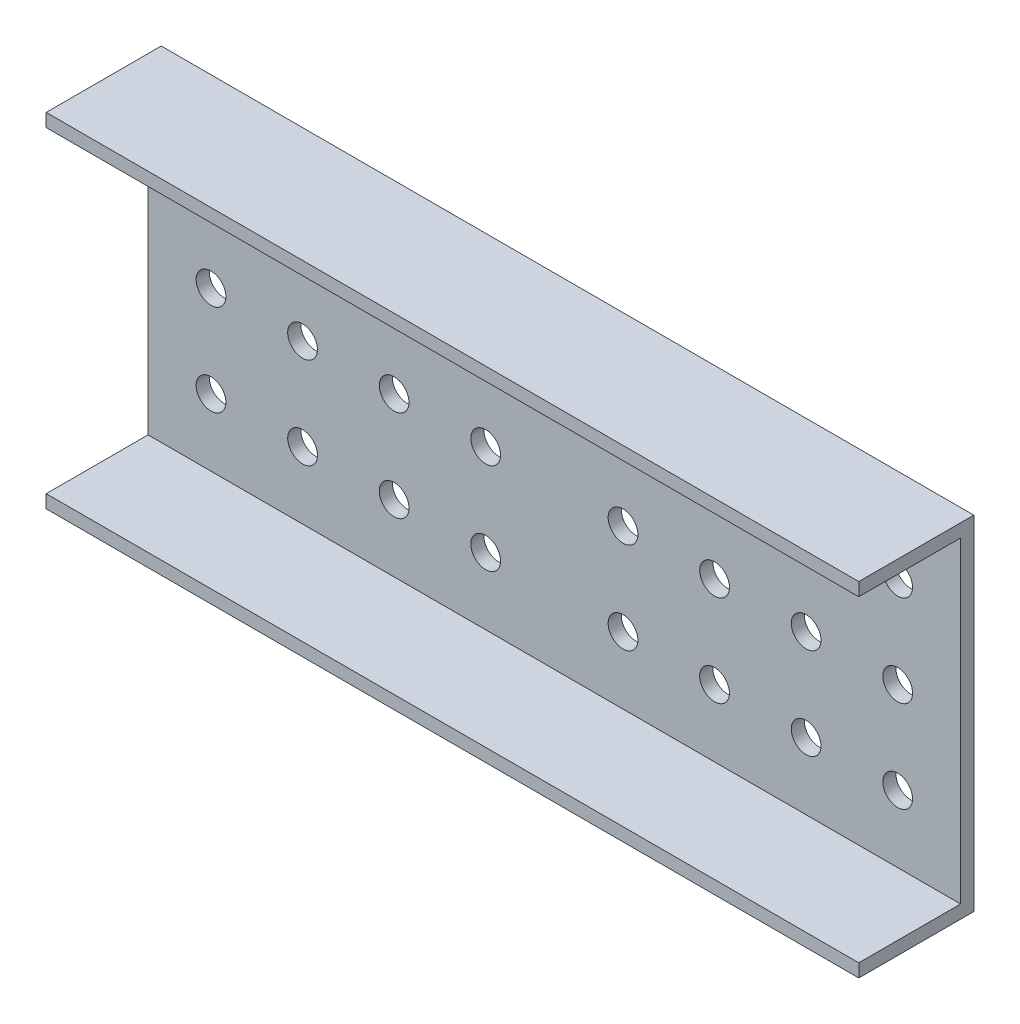
ISO-10303-21;
HEADER;
FILE_DESCRIPTION(('STEP AP214'),'2;1');
FILE_NAME('part.step','',(''),(''),'','','');
FILE_SCHEMA(('AUTOMOTIVE_DESIGN { 1 0 10303 214 1 1 1 1 }'));
ENDSEC;
DATA;
#1=APPLICATION_CONTEXT('core data for automotive mechanical design processes');
#2=APPLICATION_PROTOCOL_DEFINITION('international standard','automotive_design',2000,#1);
#3=PRODUCT_CONTEXT('',#1,'mechanical');
#4=PRODUCT('Part','Part','',(#3));
#5=PRODUCT_RELATED_PRODUCT_CATEGORY('part','',(#4));
#6=PRODUCT_DEFINITION_FORMATION('','',#4);
#7=PRODUCT_DEFINITION_CONTEXT('part definition',#1,'design');
#8=PRODUCT_DEFINITION('design','',#6,#7);
#9=PRODUCT_DEFINITION_SHAPE('','',#8);
#10=(LENGTH_UNIT() NAMED_UNIT(*) SI_UNIT(.MILLI.,.METRE.));
#11=(NAMED_UNIT(*) PLANE_ANGLE_UNIT() SI_UNIT($,.RADIAN.));
#12=(NAMED_UNIT(*) SI_UNIT($,.STERADIAN.) SOLID_ANGLE_UNIT());
#13=UNCERTAINTY_MEASURE_WITH_UNIT(LENGTH_MEASURE(1.E-05),#10,'distance_accuracy_value','');
#14=(GEOMETRIC_REPRESENTATION_CONTEXT(3) GLOBAL_UNCERTAINTY_ASSIGNED_CONTEXT((#13)) GLOBAL_UNIT_ASSIGNED_CONTEXT((#10,
#11,#12)) REPRESENTATION_CONTEXT('',''));
#15=CARTESIAN_POINT('',(0.,0.,0.));
#16=DIRECTION('',(0.,0.,1.));
#17=DIRECTION('',(1.,0.,0.));
#18=AXIS2_PLACEMENT_3D('',#15,#16,#17);
#19=CARTESIAN_POINT('',(355.,150.,11.5));
#20=DIRECTION('',(-1.,0.,0.));
#21=DIRECTION('',(0.,-1.,0.));
#22=AXIS2_PLACEMENT_3D('',#19,#20,#21);
#23=PLANE('',#22);
#24=DIRECTION('',(0.,1.,0.));
#25=VECTOR('',#24,1.);
#26=CARTESIAN_POINT('',(355.,150.,0.));
#27=LINE('',#26,#25);
#28=CARTESIAN_POINT('',(355.,-150.,0.));
#29=VERTEX_POINT('',#28);
#30=CARTESIAN_POINT('',(355.,150.,0.));
#31=VERTEX_POINT('',#30);
#32=EDGE_CURVE('E194',#29,#31,#27,.T.);
#33=ORIENTED_EDGE('',*,*,#32,.T.);
#34=DIRECTION('',(0.,0.,-1.));
#35=VECTOR('',#34,1.);
#36=CARTESIAN_POINT('',(355.,150.,11.5));
#37=LINE('',#36,#35);
#38=CARTESIAN_POINT('',(355.,150.,100.5));
#39=VERTEX_POINT('',#38);
#40=EDGE_CURVE('E208',#39,#31,#37,.T.);
#41=ORIENTED_EDGE('',*,*,#40,.F.);
#42=DIRECTION('',(0.,1.,0.));
#43=VECTOR('',#42,1.);
#44=CARTESIAN_POINT('',(355.,138.5,100.5));
#45=LINE('',#44,#43);
#46=CARTESIAN_POINT('',(355.,138.5,100.5));
#47=VERTEX_POINT('',#46);
#48=EDGE_CURVE('E145',#47,#39,#45,.T.);
#49=ORIENTED_EDGE('',*,*,#48,.F.);
#50=DIRECTION('',(0.,0.,-1.));
#51=VECTOR('',#50,1.);
#52=CARTESIAN_POINT('',(355.,138.5,100.5));
#53=LINE('',#52,#51);
#54=CARTESIAN_POINT('',(355.,138.5,11.5));
#55=VERTEX_POINT('',#54);
#56=EDGE_CURVE('E151',#47,#55,#53,.T.);
#57=ORIENTED_EDGE('',*,*,#56,.T.);
#58=DIRECTION('',(0.,1.,0.));
#59=VECTOR('',#58,1.);
#60=CARTESIAN_POINT('',(355.,150.,11.5));
#61=LINE('',#60,#59);
#62=CARTESIAN_POINT('',(355.,-138.5,11.5));
#63=VERTEX_POINT('',#62);
#64=EDGE_CURVE('E40',#63,#55,#61,.T.);
#65=ORIENTED_EDGE('',*,*,#64,.F.);
#66=DIRECTION('',(0.,0.,-1.));
#67=VECTOR('',#66,1.);
#68=CARTESIAN_POINT('',(355.,-138.5,100.5));
#69=LINE('',#68,#67);
#70=CARTESIAN_POINT('',(355.,-138.5,100.5));
#71=VERTEX_POINT('',#70);
#72=EDGE_CURVE('E137',#71,#63,#69,.T.);
#73=ORIENTED_EDGE('',*,*,#72,.F.);
#74=DIRECTION('',(0.,-1.,0.));
#75=VECTOR('',#74,1.);
#76=CARTESIAN_POINT('',(355.,-138.5,100.5));
#77=LINE('',#76,#75);
#78=CARTESIAN_POINT('',(355.,-150.,100.5));
#79=VERTEX_POINT('',#78);
#80=EDGE_CURVE('E129',#71,#79,#77,.T.);
#81=ORIENTED_EDGE('',*,*,#80,.T.);
#82=DIRECTION('',(0.,0.,-1.));
#83=VECTOR('',#82,1.);
#84=CARTESIAN_POINT('',(355.,-150.,11.5));
#85=LINE('',#84,#83);
#86=EDGE_CURVE('E116',#79,#29,#85,.T.);
#87=ORIENTED_EDGE('',*,*,#86,.T.);
#88=EDGE_LOOP('',(#33,#41,#49,#57,#65,#73,#81,#87));
#89=FACE_BOUND('',#88,.T.);
#90=ADVANCED_FACE('F36',(#89),#23,.F.);
#91=CARTESIAN_POINT('',(-355.,150.,11.5));
#92=DIRECTION('',(0.,-1.,0.));
#93=DIRECTION('',(0.,0.,-1.));
#94=AXIS2_PLACEMENT_3D('',#91,#92,#93);
#95=PLANE('',#94);
#96=DIRECTION('',(-1.,0.,0.));
#97=VECTOR('',#96,1.);
#98=CARTESIAN_POINT('',(-355.,150.,0.));
#99=LINE('',#98,#97);
#100=CARTESIAN_POINT('',(-355.,150.,0.));
#101=VERTEX_POINT('',#100);
#102=EDGE_CURVE('E201',#31,#101,#99,.T.);
#103=ORIENTED_EDGE('',*,*,#102,.T.);
#104=DIRECTION('',(0.,0.,-1.));
#105=VECTOR('',#104,1.);
#106=CARTESIAN_POINT('',(-355.,150.,11.5));
#107=LINE('',#106,#105);
#108=CARTESIAN_POINT('',(-355.,150.,100.5));
#109=VERTEX_POINT('',#108);
#110=EDGE_CURVE('E115',#109,#101,#107,.T.);
#111=ORIENTED_EDGE('',*,*,#110,.F.);
#112=DIRECTION('',(-1.,0.,0.));
#113=VECTOR('',#112,1.);
#114=CARTESIAN_POINT('',(355.,150.,100.5));
#115=LINE('',#114,#113);
#116=EDGE_CURVE('E148',#39,#109,#115,.T.);
#117=ORIENTED_EDGE('',*,*,#116,.F.);
#118=ORIENTED_EDGE('',*,*,#40,.T.);
#119=EDGE_LOOP('',(#103,#111,#117,#118));
#120=FACE_BOUND('',#119,.T.);
#121=ADVANCED_FACE('F349',(#120),#95,.F.);
#122=CARTESIAN_POINT('',(-355.,150.,11.5));
#123=DIRECTION('',(1.,0.,0.));
#124=DIRECTION('',(0.,1.,0.));
#125=AXIS2_PLACEMENT_3D('',#122,#123,#124);
#126=PLANE('',#125);
#127=DIRECTION('',(0.,-1.,0.));
#128=VECTOR('',#127,1.);
#129=CARTESIAN_POINT('',(-355.,150.,0.));
#130=LINE('',#129,#128);
#131=CARTESIAN_POINT('',(-355.,-150.,0.));
#132=VERTEX_POINT('',#131);
#133=EDGE_CURVE('E111',#101,#132,#130,.T.);
#134=ORIENTED_EDGE('',*,*,#133,.T.);
#135=DIRECTION('',(0.,0.,-1.));
#136=VECTOR('',#135,1.);
#137=CARTESIAN_POINT('',(-355.,-150.,11.5));
#138=LINE('',#137,#136);
#139=CARTESIAN_POINT('',(-355.,-150.,100.5));
#140=VERTEX_POINT('',#139);
#141=EDGE_CURVE('E103',#140,#132,#138,.T.);
#142=ORIENTED_EDGE('',*,*,#141,.F.);
#143=DIRECTION('',(0.,1.,0.));
#144=VECTOR('',#143,1.);
#145=CARTESIAN_POINT('',(-355.,-150.,100.5));
#146=LINE('',#145,#144);
#147=CARTESIAN_POINT('',(-355.,-138.5,100.5));
#148=VERTEX_POINT('',#147);
#149=EDGE_CURVE('E107',#140,#148,#146,.T.);
#150=ORIENTED_EDGE('',*,*,#149,.T.);
#151=DIRECTION('',(0.,0.,-1.));
#152=VECTOR('',#151,1.);
#153=CARTESIAN_POINT('',(-355.,-138.5,100.5));
#154=LINE('',#153,#152);
#155=CARTESIAN_POINT('',(-355.,-138.5,11.5));
#156=VERTEX_POINT('',#155);
#157=EDGE_CURVE('E134',#148,#156,#154,.T.);
#158=ORIENTED_EDGE('',*,*,#157,.T.);
#159=DIRECTION('',(0.,-1.,0.));
#160=VECTOR('',#159,1.);
#161=CARTESIAN_POINT('',(-355.,150.,11.5));
#162=LINE('',#161,#160);
#163=CARTESIAN_POINT('',(-355.,138.5,11.5));
#164=VERTEX_POINT('',#163);
#165=EDGE_CURVE('E159',#164,#156,#162,.T.);
#166=ORIENTED_EDGE('',*,*,#165,.F.);
#167=DIRECTION('',(0.,0.,-1.));
#168=VECTOR('',#167,1.);
#169=CARTESIAN_POINT('',(-355.,138.5,100.5));
#170=LINE('',#169,#168);
#171=CARTESIAN_POINT('',(-355.,138.5,100.5));
#172=VERTEX_POINT('',#171);
#173=EDGE_CURVE('E163',#172,#164,#170,.T.);
#174=ORIENTED_EDGE('',*,*,#173,.F.);
#175=DIRECTION('',(0.,-1.,0.));
#176=VECTOR('',#175,1.);
#177=CARTESIAN_POINT('',(-355.,150.,100.5));
#178=LINE('',#177,#176);
#179=EDGE_CURVE('E140',#109,#172,#178,.T.);
#180=ORIENTED_EDGE('',*,*,#179,.F.);
#181=ORIENTED_EDGE('',*,*,#110,.T.);
#182=EDGE_LOOP('',(#134,#142,#150,#158,#166,#174,#180,#181));
#183=FACE_BOUND('',#182,.T.);
#184=ADVANCED_FACE('F105',(#183),#126,.F.);
#185=CARTESIAN_POINT('',(-355.,-150.,11.5));
#186=DIRECTION('',(0.,1.,0.));
#187=DIRECTION('',(0.,0.,1.));
#188=AXIS2_PLACEMENT_3D('',#185,#186,#187);
#189=PLANE('',#188);
#190=DIRECTION('',(1.,0.,0.));
#191=VECTOR('',#190,1.);
#192=CARTESIAN_POINT('',(-355.,-150.,0.));
#193=LINE('',#192,#191);
#194=EDGE_CURVE('E204',#132,#29,#193,.T.);
#195=ORIENTED_EDGE('',*,*,#194,.T.);
#196=ORIENTED_EDGE('',*,*,#86,.F.);
#197=DIRECTION('',(-1.,0.,0.));
#198=VECTOR('',#197,1.);
#199=CARTESIAN_POINT('',(355.,-150.,100.5));
#200=LINE('',#199,#198);
#201=EDGE_CURVE('E122',#79,#140,#200,.T.);
#202=ORIENTED_EDGE('',*,*,#201,.T.);
#203=ORIENTED_EDGE('',*,*,#141,.T.);
#204=EDGE_LOOP('',(#195,#196,#202,#203));
#205=FACE_BOUND('',#204,.T.);
#206=ADVANCED_FACE('F127',(#205),#189,.F.);
#207=CARTESIAN_POINT('',(355.,-150.,11.5));
#208=DIRECTION('',(0.,0.,1.));
#209=DIRECTION('',(1.,0.,0.));
#210=AXIS2_PLACEMENT_3D('',#207,#208,#209);
#211=PLANE('',#210);
#212=DIRECTION('',(1.,0.,0.));
#213=VECTOR('',#212,1.);
#214=CARTESIAN_POINT('',(-355.,-138.5,11.5));
#215=LINE('',#214,#213);
#216=EDGE_CURVE('E54',#156,#63,#215,.T.);
#217=ORIENTED_EDGE('',*,*,#216,.T.);
#218=ORIENTED_EDGE('',*,*,#64,.T.);
#219=DIRECTION('',(1.,0.,0.));
#220=VECTOR('',#219,1.);
#221=CARTESIAN_POINT('',(-355.,138.5,11.5));
#222=LINE('',#221,#220);
#223=EDGE_CURVE('E59',#164,#55,#222,.T.);
#224=ORIENTED_EDGE('',*,*,#223,.F.);
#225=ORIENTED_EDGE('',*,*,#165,.T.);
#226=EDGE_LOOP('',(#217,#218,#224,#225));
#227=FACE_BOUND('',#226,.T.);
#228=CARTESIAN_POINT('',(-220.,80.,11.5));
#229=DIRECTION('',(0.,0.,1.));
#230=DIRECTION('',(1.,0.,0.));
#231=AXIS2_PLACEMENT_3D('',#228,#229,#230);
#232=CIRCLE('',#231,13.);
#233=CARTESIAN_POINT('',(-207.,80.,11.5));
#234=VERTEX_POINT('',#233);
#235=EDGE_CURVE('E171',#234,#234,#232,.T.);
#236=ORIENTED_EDGE('',*,*,#235,.F.);
#237=EDGE_LOOP('',(#236));
#238=FACE_BOUND('',#237,.T.);
#239=CARTESIAN_POINT('',(140.,80.,11.5));
#240=DIRECTION('',(0.,0.,1.));
#241=DIRECTION('',(1.,0.,0.));
#242=AXIS2_PLACEMENT_3D('',#239,#240,#241);
#243=CIRCLE('',#242,13.);
#244=CARTESIAN_POINT('',(153.,80.,11.5));
#245=VERTEX_POINT('',#244);
#246=EDGE_CURVE('E179',#245,#245,#243,.T.);
#247=ORIENTED_EDGE('',*,*,#246,.F.);
#248=EDGE_LOOP('',(#247));
#249=FACE_BOUND('',#248,.T.);
#250=CARTESIAN_POINT('',(60.,80.,11.5));
#251=DIRECTION('',(0.,0.,1.));
#252=DIRECTION('',(1.,0.,0.));
#253=AXIS2_PLACEMENT_3D('',#250,#251,#252);
#254=CIRCLE('',#253,13.);
#255=CARTESIAN_POINT('',(73.,80.,11.5));
#256=VERTEX_POINT('',#255);
#257=EDGE_CURVE('E184',#256,#256,#254,.T.);
#258=ORIENTED_EDGE('',*,*,#257,.F.);
#259=EDGE_LOOP('',(#258));
#260=FACE_BOUND('',#259,.T.);
#261=CARTESIAN_POINT('',(-300.,80.,11.5));
#262=DIRECTION('',(0.,0.,1.));
#263=DIRECTION('',(1.,0.,0.));
#264=AXIS2_PLACEMENT_3D('',#261,#262,#263);
#265=CIRCLE('',#264,13.);
#266=CARTESIAN_POINT('',(-287.,80.,11.5));
#267=VERTEX_POINT('',#266);
#268=EDGE_CURVE('E188',#267,#267,#265,.T.);
#269=ORIENTED_EDGE('',*,*,#268,.F.);
#270=EDGE_LOOP('',(#269));
#271=FACE_BOUND('',#270,.T.);
#272=CARTESIAN_POINT('',(220.,80.,11.5));
#273=DIRECTION('',(0.,0.,1.));
#274=DIRECTION('',(1.,0.,0.));
#275=AXIS2_PLACEMENT_3D('',#272,#273,#274);
#276=CIRCLE('',#275,13.);
#277=CARTESIAN_POINT('',(233.,80.,11.5));
#278=VERTEX_POINT('',#277);
#279=EDGE_CURVE('E214',#278,#278,#276,.T.);
#280=ORIENTED_EDGE('',*,*,#279,.F.);
#281=EDGE_LOOP('',(#280));
#282=FACE_BOUND('',#281,.T.);
#283=CARTESIAN_POINT('',(300.,80.,11.5));
#284=DIRECTION('',(0.,0.,1.));
#285=DIRECTION('',(1.,0.,0.));
#286=AXIS2_PLACEMENT_3D('',#283,#284,#285);
#287=CIRCLE('',#286,13.);
#288=CARTESIAN_POINT('',(313.,80.,11.5));
#289=VERTEX_POINT('',#288);
#290=EDGE_CURVE('E220',#289,#289,#287,.T.);
#291=ORIENTED_EDGE('',*,*,#290,.F.);
#292=EDGE_LOOP('',(#291));
#293=FACE_BOUND('',#292,.T.);
#294=CARTESIAN_POINT('',(60.,0.,11.5));
#295=DIRECTION('',(0.,0.,1.));
#296=DIRECTION('',(1.,0.,0.));
#297=AXIS2_PLACEMENT_3D('',#294,#295,#296);
#298=CIRCLE('',#297,13.);
#299=CARTESIAN_POINT('',(73.,0.,11.5));
#300=VERTEX_POINT('',#299);
#301=EDGE_CURVE('E226',#300,#300,#298,.T.);
#302=ORIENTED_EDGE('',*,*,#301,.F.);
#303=EDGE_LOOP('',(#302));
#304=FACE_BOUND('',#303,.T.);
#305=CARTESIAN_POINT('',(140.,0.,11.5));
#306=DIRECTION('',(0.,0.,1.));
#307=DIRECTION('',(1.,0.,0.));
#308=AXIS2_PLACEMENT_3D('',#305,#306,#307);
#309=CIRCLE('',#308,13.);
#310=CARTESIAN_POINT('',(153.,0.,11.5));
#311=VERTEX_POINT('',#310);
#312=EDGE_CURVE('E232',#311,#311,#309,.T.);
#313=ORIENTED_EDGE('',*,*,#312,.F.);
#314=EDGE_LOOP('',(#313));
#315=FACE_BOUND('',#314,.T.);
#316=CARTESIAN_POINT('',(220.,0.,11.5));
#317=DIRECTION('',(0.,0.,1.));
#318=DIRECTION('',(1.,0.,0.));
#319=AXIS2_PLACEMENT_3D('',#316,#317,#318);
#320=CIRCLE('',#319,13.);
#321=CARTESIAN_POINT('',(233.,0.,11.5));
#322=VERTEX_POINT('',#321);
#323=EDGE_CURVE('E238',#322,#322,#320,.T.);
#324=ORIENTED_EDGE('',*,*,#323,.F.);
#325=EDGE_LOOP('',(#324));
#326=FACE_BOUND('',#325,.T.);
#327=CARTESIAN_POINT('',(300.,0.,11.5));
#328=DIRECTION('',(0.,0.,1.));
#329=DIRECTION('',(1.,0.,0.));
#330=AXIS2_PLACEMENT_3D('',#327,#328,#329);
#331=CIRCLE('',#330,13.);
#332=CARTESIAN_POINT('',(313.,0.,11.5));
#333=VERTEX_POINT('',#332);
#334=EDGE_CURVE('E244',#333,#333,#331,.T.);
#335=ORIENTED_EDGE('',*,*,#334,.F.);
#336=EDGE_LOOP('',(#335));
#337=FACE_BOUND('',#336,.T.);
#338=CARTESIAN_POINT('',(60.,-80.,11.5));
#339=DIRECTION('',(0.,0.,1.));
#340=DIRECTION('',(1.,0.,0.));
#341=AXIS2_PLACEMENT_3D('',#338,#339,#340);
#342=CIRCLE('',#341,13.);
#343=CARTESIAN_POINT('',(73.0000000000001,-80.,11.5));
#344=VERTEX_POINT('',#343);
#345=EDGE_CURVE('E250',#344,#344,#342,.T.);
#346=ORIENTED_EDGE('',*,*,#345,.F.);
#347=EDGE_LOOP('',(#346));
#348=FACE_BOUND('',#347,.T.);
#349=CARTESIAN_POINT('',(140.,-80.,11.5));
#350=DIRECTION('',(0.,0.,1.));
#351=DIRECTION('',(1.,0.,0.));
#352=AXIS2_PLACEMENT_3D('',#349,#350,#351);
#353=CIRCLE('',#352,13.);
#354=CARTESIAN_POINT('',(153.,-80.,11.5));
#355=VERTEX_POINT('',#354);
#356=EDGE_CURVE('E256',#355,#355,#353,.T.);
#357=ORIENTED_EDGE('',*,*,#356,.F.);
#358=EDGE_LOOP('',(#357));
#359=FACE_BOUND('',#358,.T.);
#360=CARTESIAN_POINT('',(220.,-80.,11.5));
#361=DIRECTION('',(0.,0.,1.));
#362=DIRECTION('',(1.,0.,0.));
#363=AXIS2_PLACEMENT_3D('',#360,#361,#362);
#364=CIRCLE('',#363,13.);
#365=CARTESIAN_POINT('',(233.,-80.,11.5));
#366=VERTEX_POINT('',#365);
#367=EDGE_CURVE('E262',#366,#366,#364,.T.);
#368=ORIENTED_EDGE('',*,*,#367,.F.);
#369=EDGE_LOOP('',(#368));
#370=FACE_BOUND('',#369,.T.);
#371=CARTESIAN_POINT('',(300.,-80.,11.5));
#372=DIRECTION('',(0.,0.,1.));
#373=DIRECTION('',(1.,0.,0.));
#374=AXIS2_PLACEMENT_3D('',#371,#372,#373);
#375=CIRCLE('',#374,13.);
#376=CARTESIAN_POINT('',(313.,-80.,11.5));
#377=VERTEX_POINT('',#376);
#378=EDGE_CURVE('E268',#377,#377,#375,.T.);
#379=ORIENTED_EDGE('',*,*,#378,.F.);
#380=EDGE_LOOP('',(#379));
#381=FACE_BOUND('',#380,.T.);
#382=CARTESIAN_POINT('',(-140.,80.,11.5));
#383=DIRECTION('',(0.,0.,1.));
#384=DIRECTION('',(1.,0.,0.));
#385=AXIS2_PLACEMENT_3D('',#382,#383,#384);
#386=CIRCLE('',#385,13.);
#387=CARTESIAN_POINT('',(-127.,80.,11.5));
#388=VERTEX_POINT('',#387);
#389=EDGE_CURVE('E274',#388,#388,#386,.T.);
#390=ORIENTED_EDGE('',*,*,#389,.F.);
#391=EDGE_LOOP('',(#390));
#392=FACE_BOUND('',#391,.T.);
#393=CARTESIAN_POINT('',(-60.0000000000001,80.,11.5));
#394=DIRECTION('',(0.,0.,1.));
#395=DIRECTION('',(1.,0.,0.));
#396=AXIS2_PLACEMENT_3D('',#393,#394,#395);
#397=CIRCLE('',#396,13.);
#398=CARTESIAN_POINT('',(-47.,80.,11.5));
#399=VERTEX_POINT('',#398);
#400=EDGE_CURVE('E280',#399,#399,#397,.T.);
#401=ORIENTED_EDGE('',*,*,#400,.F.);
#402=EDGE_LOOP('',(#401));
#403=FACE_BOUND('',#402,.T.);
#404=CARTESIAN_POINT('',(-300.,0.,11.5));
#405=DIRECTION('',(0.,0.,1.));
#406=DIRECTION('',(1.,0.,0.));
#407=AXIS2_PLACEMENT_3D('',#404,#405,#406);
#408=CIRCLE('',#407,13.);
#409=CARTESIAN_POINT('',(-287.,0.,11.5));
#410=VERTEX_POINT('',#409);
#411=EDGE_CURVE('E286',#410,#410,#408,.T.);
#412=ORIENTED_EDGE('',*,*,#411,.F.);
#413=EDGE_LOOP('',(#412));
#414=FACE_BOUND('',#413,.T.);
#415=CARTESIAN_POINT('',(-220.,0.,11.5));
#416=DIRECTION('',(0.,0.,1.));
#417=DIRECTION('',(1.,0.,0.));
#418=AXIS2_PLACEMENT_3D('',#415,#416,#417);
#419=CIRCLE('',#418,13.);
#420=CARTESIAN_POINT('',(-207.,0.,11.5));
#421=VERTEX_POINT('',#420);
#422=EDGE_CURVE('E292',#421,#421,#419,.T.);
#423=ORIENTED_EDGE('',*,*,#422,.F.);
#424=EDGE_LOOP('',(#423));
#425=FACE_BOUND('',#424,.T.);
#426=CARTESIAN_POINT('',(-140.,0.,11.5));
#427=DIRECTION('',(0.,0.,1.));
#428=DIRECTION('',(1.,0.,0.));
#429=AXIS2_PLACEMENT_3D('',#426,#427,#428);
#430=CIRCLE('',#429,13.);
#431=CARTESIAN_POINT('',(-127.,0.,11.5));
#432=VERTEX_POINT('',#431);
#433=EDGE_CURVE('E298',#432,#432,#430,.T.);
#434=ORIENTED_EDGE('',*,*,#433,.F.);
#435=EDGE_LOOP('',(#434));
#436=FACE_BOUND('',#435,.T.);
#437=CARTESIAN_POINT('',(-60.,0.,11.5));
#438=DIRECTION('',(0.,0.,1.));
#439=DIRECTION('',(1.,0.,0.));
#440=AXIS2_PLACEMENT_3D('',#437,#438,#439);
#441=CIRCLE('',#440,13.);
#442=CARTESIAN_POINT('',(-47.,0.,11.5));
#443=VERTEX_POINT('',#442);
#444=EDGE_CURVE('E304',#443,#443,#441,.T.);
#445=ORIENTED_EDGE('',*,*,#444,.F.);
#446=EDGE_LOOP('',(#445));
#447=FACE_BOUND('',#446,.T.);
#448=CARTESIAN_POINT('',(-300.,-80.,11.5));
#449=DIRECTION('',(0.,0.,1.));
#450=DIRECTION('',(1.,0.,0.));
#451=AXIS2_PLACEMENT_3D('',#448,#449,#450);
#452=CIRCLE('',#451,13.);
#453=CARTESIAN_POINT('',(-287.,-80.,11.5));
#454=VERTEX_POINT('',#453);
#455=EDGE_CURVE('E310',#454,#454,#452,.T.);
#456=ORIENTED_EDGE('',*,*,#455,.F.);
#457=EDGE_LOOP('',(#456));
#458=FACE_BOUND('',#457,.T.);
#459=CARTESIAN_POINT('',(-220.,-80.,11.5));
#460=DIRECTION('',(0.,0.,1.));
#461=DIRECTION('',(1.,0.,0.));
#462=AXIS2_PLACEMENT_3D('',#459,#460,#461);
#463=CIRCLE('',#462,13.);
#464=CARTESIAN_POINT('',(-207.,-80.,11.5));
#465=VERTEX_POINT('',#464);
#466=EDGE_CURVE('E316',#465,#465,#463,.T.);
#467=ORIENTED_EDGE('',*,*,#466,.F.);
#468=EDGE_LOOP('',(#467));
#469=FACE_BOUND('',#468,.T.);
#470=CARTESIAN_POINT('',(-140.,-80.,11.5));
#471=DIRECTION('',(0.,0.,1.));
#472=DIRECTION('',(1.,0.,0.));
#473=AXIS2_PLACEMENT_3D('',#470,#471,#472);
#474=CIRCLE('',#473,13.);
#475=CARTESIAN_POINT('',(-127.,-80.,11.5));
#476=VERTEX_POINT('',#475);
#477=EDGE_CURVE('E322',#476,#476,#474,.T.);
#478=ORIENTED_EDGE('',*,*,#477,.F.);
#479=EDGE_LOOP('',(#478));
#480=FACE_BOUND('',#479,.T.);
#481=CARTESIAN_POINT('',(-60.,-80.,11.5));
#482=DIRECTION('',(0.,0.,1.));
#483=DIRECTION('',(1.,0.,0.));
#484=AXIS2_PLACEMENT_3D('',#481,#482,#483);
#485=CIRCLE('',#484,13.);
#486=CARTESIAN_POINT('',(-47.,-80.,11.5));
#487=VERTEX_POINT('',#486);
#488=EDGE_CURVE('E11',#487,#487,#485,.T.);
#489=ORIENTED_EDGE('',*,*,#488,.F.);
#490=EDGE_LOOP('',(#489));
#491=FACE_BOUND('',#490,.T.);
#492=ADVANCED_FACE('F336',(#227,#238,#249,#260,#271,#282,#293,#304,#315,#326,#337,#348,#359,
#370,#381,#392,#403,#414,#425,#436,#447,#458,#469,#480,#491),#211,.T.);
#493=CARTESIAN_POINT('',(355.,-150.,0.));
#494=DIRECTION('',(0.,0.,1.));
#495=DIRECTION('',(1.,0.,0.));
#496=AXIS2_PLACEMENT_3D('',#493,#494,#495);
#497=PLANE('',#496);
#498=CARTESIAN_POINT('',(-220.,80.,0.));
#499=DIRECTION('',(0.,0.,1.));
#500=DIRECTION('',(1.,0.,0.));
#501=AXIS2_PLACEMENT_3D('',#498,#499,#500);
#502=CIRCLE('',#501,13.);
#503=CARTESIAN_POINT('',(-207.,80.,0.));
#504=VERTEX_POINT('',#503);
#505=EDGE_CURVE('E154',#504,#504,#502,.T.);
#506=ORIENTED_EDGE('',*,*,#505,.T.);
#507=EDGE_LOOP('',(#506));
#508=FACE_BOUND('',#507,.T.);
#509=CARTESIAN_POINT('',(140.,80.,0.));
#510=DIRECTION('',(0.,0.,1.));
#511=DIRECTION('',(1.,0.,0.));
#512=AXIS2_PLACEMENT_3D('',#509,#510,#511);
#513=CIRCLE('',#512,13.);
#514=CARTESIAN_POINT('',(153.,80.,0.));
#515=VERTEX_POINT('',#514);
#516=EDGE_CURVE('E175',#515,#515,#513,.T.);
#517=ORIENTED_EDGE('',*,*,#516,.T.);
#518=EDGE_LOOP('',(#517));
#519=FACE_BOUND('',#518,.T.);
#520=CARTESIAN_POINT('',(60.,80.,0.));
#521=DIRECTION('',(0.,0.,1.));
#522=DIRECTION('',(1.,0.,0.));
#523=AXIS2_PLACEMENT_3D('',#520,#521,#522);
#524=CIRCLE('',#523,13.);
#525=CARTESIAN_POINT('',(73.,80.,0.));
#526=VERTEX_POINT('',#525);
#527=EDGE_CURVE('E185',#526,#526,#524,.T.);
#528=ORIENTED_EDGE('',*,*,#527,.T.);
#529=EDGE_LOOP('',(#528));
#530=FACE_BOUND('',#529,.T.);
#531=CARTESIAN_POINT('',(-300.,80.,0.));
#532=DIRECTION('',(0.,0.,1.));
#533=DIRECTION('',(1.,0.,0.));
#534=AXIS2_PLACEMENT_3D('',#531,#532,#533);
#535=CIRCLE('',#534,13.);
#536=CARTESIAN_POINT('',(-287.,80.,0.));
#537=VERTEX_POINT('',#536);
#538=EDGE_CURVE('E191',#537,#537,#535,.T.);
#539=ORIENTED_EDGE('',*,*,#538,.T.);
#540=EDGE_LOOP('',(#539));
#541=FACE_BOUND('',#540,.T.);
#542=ORIENTED_EDGE('',*,*,#32,.F.);
#543=ORIENTED_EDGE('',*,*,#194,.F.);
#544=ORIENTED_EDGE('',*,*,#133,.F.);
#545=ORIENTED_EDGE('',*,*,#102,.F.);
#546=EDGE_LOOP('',(#542,#543,#544,#545));
#547=FACE_BOUND('',#546,.T.);
#548=CARTESIAN_POINT('',(220.,80.,0.));
#549=DIRECTION('',(0.,0.,1.));
#550=DIRECTION('',(1.,0.,0.));
#551=AXIS2_PLACEMENT_3D('',#548,#549,#550);
#552=CIRCLE('',#551,13.);
#553=CARTESIAN_POINT('',(233.,80.,0.));
#554=VERTEX_POINT('',#553);
#555=EDGE_CURVE('E211',#554,#554,#552,.T.);
#556=ORIENTED_EDGE('',*,*,#555,.T.);
#557=EDGE_LOOP('',(#556));
#558=FACE_BOUND('',#557,.T.);
#559=CARTESIAN_POINT('',(300.,80.,0.));
#560=DIRECTION('',(0.,0.,1.));
#561=DIRECTION('',(1.,0.,0.));
#562=AXIS2_PLACEMENT_3D('',#559,#560,#561);
#563=CIRCLE('',#562,13.);
#564=CARTESIAN_POINT('',(313.,80.,0.));
#565=VERTEX_POINT('',#564);
#566=EDGE_CURVE('E217',#565,#565,#563,.T.);
#567=ORIENTED_EDGE('',*,*,#566,.T.);
#568=EDGE_LOOP('',(#567));
#569=FACE_BOUND('',#568,.T.);
#570=CARTESIAN_POINT('',(60.,0.,0.));
#571=DIRECTION('',(0.,0.,1.));
#572=DIRECTION('',(1.,0.,0.));
#573=AXIS2_PLACEMENT_3D('',#570,#571,#572);
#574=CIRCLE('',#573,13.);
#575=CARTESIAN_POINT('',(73.,0.,0.));
#576=VERTEX_POINT('',#575);
#577=EDGE_CURVE('E223',#576,#576,#574,.T.);
#578=ORIENTED_EDGE('',*,*,#577,.T.);
#579=EDGE_LOOP('',(#578));
#580=FACE_BOUND('',#579,.T.);
#581=CARTESIAN_POINT('',(140.,0.,0.));
#582=DIRECTION('',(0.,0.,1.));
#583=DIRECTION('',(1.,0.,0.));
#584=AXIS2_PLACEMENT_3D('',#581,#582,#583);
#585=CIRCLE('',#584,13.);
#586=CARTESIAN_POINT('',(153.,0.,0.));
#587=VERTEX_POINT('',#586);
#588=EDGE_CURVE('E229',#587,#587,#585,.T.);
#589=ORIENTED_EDGE('',*,*,#588,.T.);
#590=EDGE_LOOP('',(#589));
#591=FACE_BOUND('',#590,.T.);
#592=CARTESIAN_POINT('',(220.,0.,0.));
#593=DIRECTION('',(0.,0.,1.));
#594=DIRECTION('',(1.,0.,0.));
#595=AXIS2_PLACEMENT_3D('',#592,#593,#594);
#596=CIRCLE('',#595,13.);
#597=CARTESIAN_POINT('',(233.,0.,0.));
#598=VERTEX_POINT('',#597);
#599=EDGE_CURVE('E235',#598,#598,#596,.T.);
#600=ORIENTED_EDGE('',*,*,#599,.T.);
#601=EDGE_LOOP('',(#600));
#602=FACE_BOUND('',#601,.T.);
#603=CARTESIAN_POINT('',(300.,0.,0.));
#604=DIRECTION('',(0.,0.,1.));
#605=DIRECTION('',(1.,0.,0.));
#606=AXIS2_PLACEMENT_3D('',#603,#604,#605);
#607=CIRCLE('',#606,13.);
#608=CARTESIAN_POINT('',(313.,0.,0.));
#609=VERTEX_POINT('',#608);
#610=EDGE_CURVE('E241',#609,#609,#607,.T.);
#611=ORIENTED_EDGE('',*,*,#610,.T.);
#612=EDGE_LOOP('',(#611));
#613=FACE_BOUND('',#612,.T.);
#614=CARTESIAN_POINT('',(60.,-80.,0.));
#615=DIRECTION('',(0.,0.,1.));
#616=DIRECTION('',(1.,0.,0.));
#617=AXIS2_PLACEMENT_3D('',#614,#615,#616);
#618=CIRCLE('',#617,13.);
#619=CARTESIAN_POINT('',(73.0000000000001,-80.,0.));
#620=VERTEX_POINT('',#619);
#621=EDGE_CURVE('E247',#620,#620,#618,.T.);
#622=ORIENTED_EDGE('',*,*,#621,.T.);
#623=EDGE_LOOP('',(#622));
#624=FACE_BOUND('',#623,.T.);
#625=CARTESIAN_POINT('',(140.,-80.,0.));
#626=DIRECTION('',(0.,0.,1.));
#627=DIRECTION('',(1.,0.,0.));
#628=AXIS2_PLACEMENT_3D('',#625,#626,#627);
#629=CIRCLE('',#628,13.);
#630=CARTESIAN_POINT('',(153.,-80.,0.));
#631=VERTEX_POINT('',#630);
#632=EDGE_CURVE('E253',#631,#631,#629,.T.);
#633=ORIENTED_EDGE('',*,*,#632,.T.);
#634=EDGE_LOOP('',(#633));
#635=FACE_BOUND('',#634,.T.);
#636=CARTESIAN_POINT('',(220.,-80.,0.));
#637=DIRECTION('',(0.,0.,1.));
#638=DIRECTION('',(1.,0.,0.));
#639=AXIS2_PLACEMENT_3D('',#636,#637,#638);
#640=CIRCLE('',#639,13.);
#641=CARTESIAN_POINT('',(233.,-80.,0.));
#642=VERTEX_POINT('',#641);
#643=EDGE_CURVE('E259',#642,#642,#640,.T.);
#644=ORIENTED_EDGE('',*,*,#643,.T.);
#645=EDGE_LOOP('',(#644));
#646=FACE_BOUND('',#645,.T.);
#647=CARTESIAN_POINT('',(300.,-80.,0.));
#648=DIRECTION('',(0.,0.,1.));
#649=DIRECTION('',(1.,0.,0.));
#650=AXIS2_PLACEMENT_3D('',#647,#648,#649);
#651=CIRCLE('',#650,13.);
#652=CARTESIAN_POINT('',(313.,-80.,0.));
#653=VERTEX_POINT('',#652);
#654=EDGE_CURVE('E265',#653,#653,#651,.T.);
#655=ORIENTED_EDGE('',*,*,#654,.T.);
#656=EDGE_LOOP('',(#655));
#657=FACE_BOUND('',#656,.T.);
#658=CARTESIAN_POINT('',(-140.,80.,0.));
#659=DIRECTION('',(0.,0.,1.));
#660=DIRECTION('',(1.,0.,0.));
#661=AXIS2_PLACEMENT_3D('',#658,#659,#660);
#662=CIRCLE('',#661,13.);
#663=CARTESIAN_POINT('',(-127.,80.,0.));
#664=VERTEX_POINT('',#663);
#665=EDGE_CURVE('E271',#664,#664,#662,.T.);
#666=ORIENTED_EDGE('',*,*,#665,.T.);
#667=EDGE_LOOP('',(#666));
#668=FACE_BOUND('',#667,.T.);
#669=CARTESIAN_POINT('',(-60.0000000000001,80.,0.));
#670=DIRECTION('',(0.,0.,1.));
#671=DIRECTION('',(1.,0.,0.));
#672=AXIS2_PLACEMENT_3D('',#669,#670,#671);
#673=CIRCLE('',#672,13.);
#674=CARTESIAN_POINT('',(-47.,80.,0.));
#675=VERTEX_POINT('',#674);
#676=EDGE_CURVE('E277',#675,#675,#673,.T.);
#677=ORIENTED_EDGE('',*,*,#676,.T.);
#678=EDGE_LOOP('',(#677));
#679=FACE_BOUND('',#678,.T.);
#680=CARTESIAN_POINT('',(-300.,0.,0.));
#681=DIRECTION('',(0.,0.,1.));
#682=DIRECTION('',(1.,0.,0.));
#683=AXIS2_PLACEMENT_3D('',#680,#681,#682);
#684=CIRCLE('',#683,13.);
#685=CARTESIAN_POINT('',(-287.,0.,0.));
#686=VERTEX_POINT('',#685);
#687=EDGE_CURVE('E283',#686,#686,#684,.T.);
#688=ORIENTED_EDGE('',*,*,#687,.T.);
#689=EDGE_LOOP('',(#688));
#690=FACE_BOUND('',#689,.T.);
#691=CARTESIAN_POINT('',(-220.,0.,0.));
#692=DIRECTION('',(0.,0.,1.));
#693=DIRECTION('',(1.,0.,0.));
#694=AXIS2_PLACEMENT_3D('',#691,#692,#693);
#695=CIRCLE('',#694,13.);
#696=CARTESIAN_POINT('',(-207.,0.,0.));
#697=VERTEX_POINT('',#696);
#698=EDGE_CURVE('E289',#697,#697,#695,.T.);
#699=ORIENTED_EDGE('',*,*,#698,.T.);
#700=EDGE_LOOP('',(#699));
#701=FACE_BOUND('',#700,.T.);
#702=CARTESIAN_POINT('',(-140.,0.,0.));
#703=DIRECTION('',(0.,0.,1.));
#704=DIRECTION('',(1.,0.,0.));
#705=AXIS2_PLACEMENT_3D('',#702,#703,#704);
#706=CIRCLE('',#705,13.);
#707=CARTESIAN_POINT('',(-127.,0.,0.));
#708=VERTEX_POINT('',#707);
#709=EDGE_CURVE('E295',#708,#708,#706,.T.);
#710=ORIENTED_EDGE('',*,*,#709,.T.);
#711=EDGE_LOOP('',(#710));
#712=FACE_BOUND('',#711,.T.);
#713=CARTESIAN_POINT('',(-60.,0.,0.));
#714=DIRECTION('',(0.,0.,1.));
#715=DIRECTION('',(1.,0.,0.));
#716=AXIS2_PLACEMENT_3D('',#713,#714,#715);
#717=CIRCLE('',#716,13.);
#718=CARTESIAN_POINT('',(-47.,0.,0.));
#719=VERTEX_POINT('',#718);
#720=EDGE_CURVE('E301',#719,#719,#717,.T.);
#721=ORIENTED_EDGE('',*,*,#720,.T.);
#722=EDGE_LOOP('',(#721));
#723=FACE_BOUND('',#722,.T.);
#724=CARTESIAN_POINT('',(-300.,-80.,0.));
#725=DIRECTION('',(0.,0.,1.));
#726=DIRECTION('',(1.,0.,0.));
#727=AXIS2_PLACEMENT_3D('',#724,#725,#726);
#728=CIRCLE('',#727,13.);
#729=CARTESIAN_POINT('',(-287.,-80.,0.));
#730=VERTEX_POINT('',#729);
#731=EDGE_CURVE('E307',#730,#730,#728,.T.);
#732=ORIENTED_EDGE('',*,*,#731,.T.);
#733=EDGE_LOOP('',(#732));
#734=FACE_BOUND('',#733,.T.);
#735=CARTESIAN_POINT('',(-220.,-80.,0.));
#736=DIRECTION('',(0.,0.,1.));
#737=DIRECTION('',(1.,0.,0.));
#738=AXIS2_PLACEMENT_3D('',#735,#736,#737);
#739=CIRCLE('',#738,13.);
#740=CARTESIAN_POINT('',(-207.,-80.,0.));
#741=VERTEX_POINT('',#740);
#742=EDGE_CURVE('E313',#741,#741,#739,.T.);
#743=ORIENTED_EDGE('',*,*,#742,.T.);
#744=EDGE_LOOP('',(#743));
#745=FACE_BOUND('',#744,.T.);
#746=CARTESIAN_POINT('',(-140.,-80.,0.));
#747=DIRECTION('',(0.,0.,1.));
#748=DIRECTION('',(1.,0.,0.));
#749=AXIS2_PLACEMENT_3D('',#746,#747,#748);
#750=CIRCLE('',#749,13.);
#751=CARTESIAN_POINT('',(-127.,-80.,0.));
#752=VERTEX_POINT('',#751);
#753=EDGE_CURVE('E319',#752,#752,#750,.T.);
#754=ORIENTED_EDGE('',*,*,#753,.T.);
#755=EDGE_LOOP('',(#754));
#756=FACE_BOUND('',#755,.T.);
#757=CARTESIAN_POINT('',(-60.,-80.,0.));
#758=DIRECTION('',(0.,0.,1.));
#759=DIRECTION('',(1.,0.,0.));
#760=AXIS2_PLACEMENT_3D('',#757,#758,#759);
#761=CIRCLE('',#760,13.);
#762=CARTESIAN_POINT('',(-47.,-80.,0.));
#763=VERTEX_POINT('',#762);
#764=EDGE_CURVE('E46',#763,#763,#761,.T.);
#765=ORIENTED_EDGE('',*,*,#764,.T.);
#766=EDGE_LOOP('',(#765));
#767=FACE_BOUND('',#766,.T.);
#768=ADVANCED_FACE('F328',(#508,#519,#530,#541,#547,#558,#569,#580,#591,#602,#613,#624,#635,
#646,#657,#668,#679,#690,#701,#712,#723,#734,#745,#756,#767),#497,.F.);
#769=CARTESIAN_POINT('',(-300.,80.,0.));
#770=DIRECTION('',(0.,0.,1.));
#771=DIRECTION('',(1.,0.,0.));
#772=AXIS2_PLACEMENT_3D('',#769,#770,#771);
#773=CYLINDRICAL_SURFACE('',#772,13.);
#774=ORIENTED_EDGE('',*,*,#538,.F.);
#775=EDGE_LOOP('',(#774));
#776=FACE_BOUND('',#775,.T.);
#777=ORIENTED_EDGE('',*,*,#268,.T.);
#778=EDGE_LOOP('',(#777));
#779=FACE_BOUND('',#778,.T.);
#780=ADVANCED_FACE('F343',(#776,#779),#773,.F.);
#781=CARTESIAN_POINT('',(60.,80.,0.));
#782=DIRECTION('',(0.,0.,1.));
#783=DIRECTION('',(1.,0.,0.));
#784=AXIS2_PLACEMENT_3D('',#781,#782,#783);
#785=CYLINDRICAL_SURFACE('',#784,13.);
#786=ORIENTED_EDGE('',*,*,#527,.F.);
#787=EDGE_LOOP('',(#786));
#788=FACE_BOUND('',#787,.T.);
#789=ORIENTED_EDGE('',*,*,#257,.T.);
#790=EDGE_LOOP('',(#789));
#791=FACE_BOUND('',#790,.T.);
#792=ADVANCED_FACE('F634',(#788,#791),#785,.F.);
#793=CARTESIAN_POINT('',(140.,80.,0.));
#794=DIRECTION('',(0.,0.,1.));
#795=DIRECTION('',(1.,0.,0.));
#796=AXIS2_PLACEMENT_3D('',#793,#794,#795);
#797=CYLINDRICAL_SURFACE('',#796,13.);
#798=ORIENTED_EDGE('',*,*,#516,.F.);
#799=EDGE_LOOP('',(#798));
#800=FACE_BOUND('',#799,.T.);
#801=ORIENTED_EDGE('',*,*,#246,.T.);
#802=EDGE_LOOP('',(#801));
#803=FACE_BOUND('',#802,.T.);
#804=ADVANCED_FACE('F363',(#800,#803),#797,.F.);
#805=CARTESIAN_POINT('',(220.,80.,0.));
#806=DIRECTION('',(0.,0.,1.));
#807=DIRECTION('',(1.,0.,0.));
#808=AXIS2_PLACEMENT_3D('',#805,#806,#807);
#809=CYLINDRICAL_SURFACE('',#808,13.);
#810=ORIENTED_EDGE('',*,*,#555,.F.);
#811=EDGE_LOOP('',(#810));
#812=FACE_BOUND('',#811,.T.);
#813=ORIENTED_EDGE('',*,*,#279,.T.);
#814=EDGE_LOOP('',(#813));
#815=FACE_BOUND('',#814,.T.);
#816=ADVANCED_FACE('F359',(#812,#815),#809,.F.);
#817=CARTESIAN_POINT('',(300.,80.,0.));
#818=DIRECTION('',(0.,0.,1.));
#819=DIRECTION('',(1.,0.,0.));
#820=AXIS2_PLACEMENT_3D('',#817,#818,#819);
#821=CYLINDRICAL_SURFACE('',#820,13.);
#822=ORIENTED_EDGE('',*,*,#566,.F.);
#823=EDGE_LOOP('',(#822));
#824=FACE_BOUND('',#823,.T.);
#825=ORIENTED_EDGE('',*,*,#290,.T.);
#826=EDGE_LOOP('',(#825));
#827=FACE_BOUND('',#826,.T.);
#828=ADVANCED_FACE('F362',(#824,#827),#821,.F.);
#829=CARTESIAN_POINT('',(60.,0.,0.));
#830=DIRECTION('',(0.,0.,1.));
#831=DIRECTION('',(1.,0.,0.));
#832=AXIS2_PLACEMENT_3D('',#829,#830,#831);
#833=CYLINDRICAL_SURFACE('',#832,13.);
#834=ORIENTED_EDGE('',*,*,#577,.F.);
#835=EDGE_LOOP('',(#834));
#836=FACE_BOUND('',#835,.T.);
#837=ORIENTED_EDGE('',*,*,#301,.T.);
#838=EDGE_LOOP('',(#837));
#839=FACE_BOUND('',#838,.T.);
#840=ADVANCED_FACE('F367',(#836,#839),#833,.F.);
#841=CARTESIAN_POINT('',(140.,0.,0.));
#842=DIRECTION('',(0.,0.,1.));
#843=DIRECTION('',(1.,0.,0.));
#844=AXIS2_PLACEMENT_3D('',#841,#842,#843);
#845=CYLINDRICAL_SURFACE('',#844,13.);
#846=ORIENTED_EDGE('',*,*,#588,.F.);
#847=EDGE_LOOP('',(#846));
#848=FACE_BOUND('',#847,.T.);
#849=ORIENTED_EDGE('',*,*,#312,.T.);
#850=EDGE_LOOP('',(#849));
#851=FACE_BOUND('',#850,.T.);
#852=ADVANCED_FACE('F371',(#848,#851),#845,.F.);
#853=CARTESIAN_POINT('',(220.,0.,0.));
#854=DIRECTION('',(0.,0.,1.));
#855=DIRECTION('',(1.,0.,0.));
#856=AXIS2_PLACEMENT_3D('',#853,#854,#855);
#857=CYLINDRICAL_SURFACE('',#856,13.);
#858=ORIENTED_EDGE('',*,*,#599,.F.);
#859=EDGE_LOOP('',(#858));
#860=FACE_BOUND('',#859,.T.);
#861=ORIENTED_EDGE('',*,*,#323,.T.);
#862=EDGE_LOOP('',(#861));
#863=FACE_BOUND('',#862,.T.);
#864=ADVANCED_FACE('F375',(#860,#863),#857,.F.);
#865=CARTESIAN_POINT('',(300.,0.,0.));
#866=DIRECTION('',(0.,0.,1.));
#867=DIRECTION('',(1.,0.,0.));
#868=AXIS2_PLACEMENT_3D('',#865,#866,#867);
#869=CYLINDRICAL_SURFACE('',#868,13.);
#870=ORIENTED_EDGE('',*,*,#610,.F.);
#871=EDGE_LOOP('',(#870));
#872=FACE_BOUND('',#871,.T.);
#873=ORIENTED_EDGE('',*,*,#334,.T.);
#874=EDGE_LOOP('',(#873));
#875=FACE_BOUND('',#874,.T.);
#876=ADVANCED_FACE('F379',(#872,#875),#869,.F.);
#877=CARTESIAN_POINT('',(60.,-80.,0.));
#878=DIRECTION('',(0.,0.,1.));
#879=DIRECTION('',(1.,0.,0.));
#880=AXIS2_PLACEMENT_3D('',#877,#878,#879);
#881=CYLINDRICAL_SURFACE('',#880,13.);
#882=ORIENTED_EDGE('',*,*,#621,.F.);
#883=EDGE_LOOP('',(#882));
#884=FACE_BOUND('',#883,.T.);
#885=ORIENTED_EDGE('',*,*,#345,.T.);
#886=EDGE_LOOP('',(#885));
#887=FACE_BOUND('',#886,.T.);
#888=ADVANCED_FACE('F383',(#884,#887),#881,.F.);
#889=CARTESIAN_POINT('',(140.,-80.,0.));
#890=DIRECTION('',(0.,0.,1.));
#891=DIRECTION('',(1.,0.,0.));
#892=AXIS2_PLACEMENT_3D('',#889,#890,#891);
#893=CYLINDRICAL_SURFACE('',#892,13.);
#894=ORIENTED_EDGE('',*,*,#632,.F.);
#895=EDGE_LOOP('',(#894));
#896=FACE_BOUND('',#895,.T.);
#897=ORIENTED_EDGE('',*,*,#356,.T.);
#898=EDGE_LOOP('',(#897));
#899=FACE_BOUND('',#898,.T.);
#900=ADVANCED_FACE('F387',(#896,#899),#893,.F.);
#901=CARTESIAN_POINT('',(220.,-80.,0.));
#902=DIRECTION('',(0.,0.,1.));
#903=DIRECTION('',(1.,0.,0.));
#904=AXIS2_PLACEMENT_3D('',#901,#902,#903);
#905=CYLINDRICAL_SURFACE('',#904,13.);
#906=ORIENTED_EDGE('',*,*,#643,.F.);
#907=EDGE_LOOP('',(#906));
#908=FACE_BOUND('',#907,.T.);
#909=ORIENTED_EDGE('',*,*,#367,.T.);
#910=EDGE_LOOP('',(#909));
#911=FACE_BOUND('',#910,.T.);
#912=ADVANCED_FACE('F391',(#908,#911),#905,.F.);
#913=CARTESIAN_POINT('',(300.,-80.,0.));
#914=DIRECTION('',(0.,0.,1.));
#915=DIRECTION('',(1.,0.,0.));
#916=AXIS2_PLACEMENT_3D('',#913,#914,#915);
#917=CYLINDRICAL_SURFACE('',#916,13.);
#918=ORIENTED_EDGE('',*,*,#654,.F.);
#919=EDGE_LOOP('',(#918));
#920=FACE_BOUND('',#919,.T.);
#921=ORIENTED_EDGE('',*,*,#378,.T.);
#922=EDGE_LOOP('',(#921));
#923=FACE_BOUND('',#922,.T.);
#924=ADVANCED_FACE('F395',(#920,#923),#917,.F.);
#925=CARTESIAN_POINT('',(-220.,80.,0.));
#926=DIRECTION('',(0.,0.,1.));
#927=DIRECTION('',(1.,0.,0.));
#928=AXIS2_PLACEMENT_3D('',#925,#926,#927);
#929=CYLINDRICAL_SURFACE('',#928,13.);
#930=ORIENTED_EDGE('',*,*,#505,.F.);
#931=EDGE_LOOP('',(#930));
#932=FACE_BOUND('',#931,.T.);
#933=ORIENTED_EDGE('',*,*,#235,.T.);
#934=EDGE_LOOP('',(#933));
#935=FACE_BOUND('',#934,.T.);
#936=ADVANCED_FACE('F399',(#932,#935),#929,.F.);
#937=CARTESIAN_POINT('',(-140.,80.,0.));
#938=DIRECTION('',(0.,0.,1.));
#939=DIRECTION('',(1.,0.,0.));
#940=AXIS2_PLACEMENT_3D('',#937,#938,#939);
#941=CYLINDRICAL_SURFACE('',#940,13.);
#942=ORIENTED_EDGE('',*,*,#665,.F.);
#943=EDGE_LOOP('',(#942));
#944=FACE_BOUND('',#943,.T.);
#945=ORIENTED_EDGE('',*,*,#389,.T.);
#946=EDGE_LOOP('',(#945));
#947=FACE_BOUND('',#946,.T.);
#948=ADVANCED_FACE('F401',(#944,#947),#941,.F.);
#949=CARTESIAN_POINT('',(-60.0000000000001,80.,0.));
#950=DIRECTION('',(0.,0.,1.));
#951=DIRECTION('',(1.,0.,0.));
#952=AXIS2_PLACEMENT_3D('',#949,#950,#951);
#953=CYLINDRICAL_SURFACE('',#952,13.);
#954=ORIENTED_EDGE('',*,*,#676,.F.);
#955=EDGE_LOOP('',(#954));
#956=FACE_BOUND('',#955,.T.);
#957=ORIENTED_EDGE('',*,*,#400,.T.);
#958=EDGE_LOOP('',(#957));
#959=FACE_BOUND('',#958,.T.);
#960=ADVANCED_FACE('F404',(#956,#959),#953,.F.);
#961=CARTESIAN_POINT('',(-300.,0.,0.));
#962=DIRECTION('',(0.,0.,1.));
#963=DIRECTION('',(1.,0.,0.));
#964=AXIS2_PLACEMENT_3D('',#961,#962,#963);
#965=CYLINDRICAL_SURFACE('',#964,13.);
#966=ORIENTED_EDGE('',*,*,#687,.F.);
#967=EDGE_LOOP('',(#966));
#968=FACE_BOUND('',#967,.T.);
#969=ORIENTED_EDGE('',*,*,#411,.T.);
#970=EDGE_LOOP('',(#969));
#971=FACE_BOUND('',#970,.T.);
#972=ADVANCED_FACE('F408',(#968,#971),#965,.F.);
#973=CARTESIAN_POINT('',(-220.,0.,0.));
#974=DIRECTION('',(0.,0.,1.));
#975=DIRECTION('',(1.,0.,0.));
#976=AXIS2_PLACEMENT_3D('',#973,#974,#975);
#977=CYLINDRICAL_SURFACE('',#976,13.);
#978=ORIENTED_EDGE('',*,*,#698,.F.);
#979=EDGE_LOOP('',(#978));
#980=FACE_BOUND('',#979,.T.);
#981=ORIENTED_EDGE('',*,*,#422,.T.);
#982=EDGE_LOOP('',(#981));
#983=FACE_BOUND('',#982,.T.);
#984=ADVANCED_FACE('F412',(#980,#983),#977,.F.);
#985=CARTESIAN_POINT('',(-140.,0.,0.));
#986=DIRECTION('',(0.,0.,1.));
#987=DIRECTION('',(1.,0.,0.));
#988=AXIS2_PLACEMENT_3D('',#985,#986,#987);
#989=CYLINDRICAL_SURFACE('',#988,13.);
#990=ORIENTED_EDGE('',*,*,#709,.F.);
#991=EDGE_LOOP('',(#990));
#992=FACE_BOUND('',#991,.T.);
#993=ORIENTED_EDGE('',*,*,#433,.T.);
#994=EDGE_LOOP('',(#993));
#995=FACE_BOUND('',#994,.T.);
#996=ADVANCED_FACE('F416',(#992,#995),#989,.F.);
#997=CARTESIAN_POINT('',(-60.,0.,0.));
#998=DIRECTION('',(0.,0.,1.));
#999=DIRECTION('',(1.,0.,0.));
#1000=AXIS2_PLACEMENT_3D('',#997,#998,#999);
#1001=CYLINDRICAL_SURFACE('',#1000,13.);
#1002=ORIENTED_EDGE('',*,*,#720,.F.);
#1003=EDGE_LOOP('',(#1002));
#1004=FACE_BOUND('',#1003,.T.);
#1005=ORIENTED_EDGE('',*,*,#444,.T.);
#1006=EDGE_LOOP('',(#1005));
#1007=FACE_BOUND('',#1006,.T.);
#1008=ADVANCED_FACE('F420',(#1004,#1007),#1001,.F.);
#1009=CARTESIAN_POINT('',(-300.,-80.,0.));
#1010=DIRECTION('',(0.,0.,1.));
#1011=DIRECTION('',(1.,0.,0.));
#1012=AXIS2_PLACEMENT_3D('',#1009,#1010,#1011);
#1013=CYLINDRICAL_SURFACE('',#1012,13.);
#1014=ORIENTED_EDGE('',*,*,#731,.F.);
#1015=EDGE_LOOP('',(#1014));
#1016=FACE_BOUND('',#1015,.T.);
#1017=ORIENTED_EDGE('',*,*,#455,.T.);
#1018=EDGE_LOOP('',(#1017));
#1019=FACE_BOUND('',#1018,.T.);
#1020=ADVANCED_FACE('F424',(#1016,#1019),#1013,.F.);
#1021=CARTESIAN_POINT('',(-220.,-80.,0.));
#1022=DIRECTION('',(0.,0.,1.));
#1023=DIRECTION('',(1.,0.,0.));
#1024=AXIS2_PLACEMENT_3D('',#1021,#1022,#1023);
#1025=CYLINDRICAL_SURFACE('',#1024,13.);
#1026=ORIENTED_EDGE('',*,*,#742,.F.);
#1027=EDGE_LOOP('',(#1026));
#1028=FACE_BOUND('',#1027,.T.);
#1029=ORIENTED_EDGE('',*,*,#466,.T.);
#1030=EDGE_LOOP('',(#1029));
#1031=FACE_BOUND('',#1030,.T.);
#1032=ADVANCED_FACE('F428',(#1028,#1031),#1025,.F.);
#1033=CARTESIAN_POINT('',(-140.,-80.,0.));
#1034=DIRECTION('',(0.,0.,1.));
#1035=DIRECTION('',(1.,0.,0.));
#1036=AXIS2_PLACEMENT_3D('',#1033,#1034,#1035);
#1037=CYLINDRICAL_SURFACE('',#1036,13.);
#1038=ORIENTED_EDGE('',*,*,#753,.F.);
#1039=EDGE_LOOP('',(#1038));
#1040=FACE_BOUND('',#1039,.T.);
#1041=ORIENTED_EDGE('',*,*,#477,.T.);
#1042=EDGE_LOOP('',(#1041));
#1043=FACE_BOUND('',#1042,.T.);
#1044=ADVANCED_FACE('F333',(#1040,#1043),#1037,.F.);
#1045=CARTESIAN_POINT('',(-60.,-80.,0.));
#1046=DIRECTION('',(0.,0.,1.));
#1047=DIRECTION('',(1.,0.,0.));
#1048=AXIS2_PLACEMENT_3D('',#1045,#1046,#1047);
#1049=CYLINDRICAL_SURFACE('',#1048,13.);
#1050=ORIENTED_EDGE('',*,*,#764,.F.);
#1051=EDGE_LOOP('',(#1050));
#1052=FACE_BOUND('',#1051,.T.);
#1053=ORIENTED_EDGE('',*,*,#488,.T.);
#1054=EDGE_LOOP('',(#1053));
#1055=FACE_BOUND('',#1054,.T.);
#1056=ADVANCED_FACE('F38',(#1052,#1055),#1049,.F.);
#1057=CARTESIAN_POINT('',(-355.,138.5,100.5));
#1058=DIRECTION('',(0.,1.,0.));
#1059=DIRECTION('',(0.,0.,1.));
#1060=AXIS2_PLACEMENT_3D('',#1057,#1058,#1059);
#1061=PLANE('',#1060);
#1062=ORIENTED_EDGE('',*,*,#223,.T.);
#1063=ORIENTED_EDGE('',*,*,#56,.F.);
#1064=DIRECTION('',(1.,0.,0.));
#1065=VECTOR('',#1064,1.);
#1066=CARTESIAN_POINT('',(-355.,138.5,100.5));
#1067=LINE('',#1066,#1065);
#1068=EDGE_CURVE('E143',#172,#47,#1067,.T.);
#1069=ORIENTED_EDGE('',*,*,#1068,.F.);
#1070=ORIENTED_EDGE('',*,*,#173,.T.);
#1071=EDGE_LOOP('',(#1062,#1063,#1069,#1070));
#1072=FACE_BOUND('',#1071,.T.);
#1073=ADVANCED_FACE('F332',(#1072),#1061,.F.);
#1074=CARTESIAN_POINT('',(-355.,138.5,100.5));
#1075=DIRECTION('',(0.,0.,1.));
#1076=DIRECTION('',(1.,0.,0.));
#1077=AXIS2_PLACEMENT_3D('',#1074,#1075,#1076);
#1078=PLANE('',#1077);
#1079=ORIENTED_EDGE('',*,*,#179,.T.);
#1080=ORIENTED_EDGE('',*,*,#1068,.T.);
#1081=ORIENTED_EDGE('',*,*,#48,.T.);
#1082=ORIENTED_EDGE('',*,*,#116,.T.);
#1083=EDGE_LOOP('',(#1079,#1080,#1081,#1082));
#1084=FACE_BOUND('',#1083,.T.);
#1085=ADVANCED_FACE('F454',(#1084),#1078,.T.);
#1086=CARTESIAN_POINT('',(-355.,-138.5,100.5));
#1087=DIRECTION('',(0.,1.,0.));
#1088=DIRECTION('',(0.,0.,1.));
#1089=AXIS2_PLACEMENT_3D('',#1086,#1087,#1088);
#1090=PLANE('',#1089);
#1091=ORIENTED_EDGE('',*,*,#216,.F.);
#1092=ORIENTED_EDGE('',*,*,#157,.F.);
#1093=DIRECTION('',(1.,0.,0.));
#1094=VECTOR('',#1093,1.);
#1095=CARTESIAN_POINT('',(-355.,-138.5,100.5));
#1096=LINE('',#1095,#1094);
#1097=EDGE_CURVE('E125',#148,#71,#1096,.T.);
#1098=ORIENTED_EDGE('',*,*,#1097,.T.);
#1099=ORIENTED_EDGE('',*,*,#72,.T.);
#1100=EDGE_LOOP('',(#1091,#1092,#1098,#1099));
#1101=FACE_BOUND('',#1100,.T.);
#1102=ADVANCED_FACE('F461',(#1101),#1090,.T.);
#1103=CARTESIAN_POINT('',(-355.,-138.5,100.5));
#1104=DIRECTION('',(0.,0.,1.));
#1105=DIRECTION('',(1.,0.,0.));
#1106=AXIS2_PLACEMENT_3D('',#1103,#1104,#1105);
#1107=PLANE('',#1106);
#1108=ORIENTED_EDGE('',*,*,#149,.F.);
#1109=ORIENTED_EDGE('',*,*,#201,.F.);
#1110=ORIENTED_EDGE('',*,*,#80,.F.);
#1111=ORIENTED_EDGE('',*,*,#1097,.F.);
#1112=EDGE_LOOP('',(#1108,#1109,#1110,#1111));
#1113=FACE_BOUND('',#1112,.T.);
#1114=ADVANCED_FACE('F120',(#1113),#1107,.T.);
#1115=CLOSED_SHELL('',(#90,#121,#184,#206,#492,#768,#780,#792,#804,#816,#828,#840,#852,#864,
#876,#888,#900,#912,#924,#936,#948,#960,#972,#984,#996,#1008,#1020,#1032,#1044,#1056,#1073,
#1085,#1102,#1114));
#1116=MANIFOLD_SOLID_BREP('B2',#1115);
#1117=ADVANCED_BREP_SHAPE_REPRESENTATION('',(#18,#1116),#14);
#1118=SHAPE_DEFINITION_REPRESENTATION(#9,#1117);
ENDSEC;
END-ISO-10303-21;
